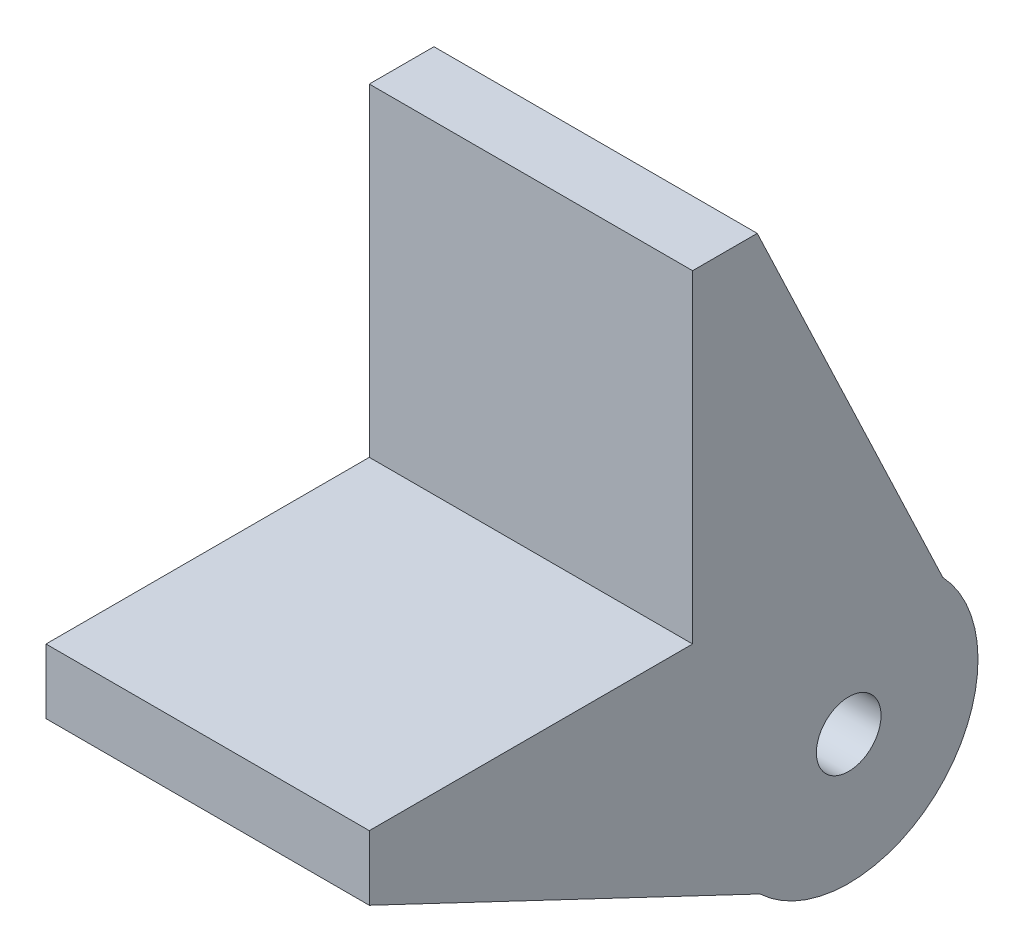
ISO-10303-21;
HEADER;
FILE_DESCRIPTION(('STEP AP214'),'2;1');
FILE_NAME('part.step','',(''),(''),'','','');
FILE_SCHEMA(('AUTOMOTIVE_DESIGN { 1 0 10303 214 1 1 1 1 }'));
ENDSEC;
DATA;
#1=APPLICATION_CONTEXT('core data for automotive mechanical design processes');
#2=APPLICATION_PROTOCOL_DEFINITION('international standard','automotive_design',2000,#1);
#3=PRODUCT_CONTEXT('',#1,'mechanical');
#4=PRODUCT('Part','Part','',(#3));
#5=PRODUCT_RELATED_PRODUCT_CATEGORY('part','',(#4));
#6=PRODUCT_DEFINITION_FORMATION('','',#4);
#7=PRODUCT_DEFINITION_CONTEXT('part definition',#1,'design');
#8=PRODUCT_DEFINITION('design','',#6,#7);
#9=PRODUCT_DEFINITION_SHAPE('','',#8);
#10=(LENGTH_UNIT() NAMED_UNIT(*) SI_UNIT(.MILLI.,.METRE.));
#11=(NAMED_UNIT(*) PLANE_ANGLE_UNIT() SI_UNIT($,.RADIAN.));
#12=(NAMED_UNIT(*) SI_UNIT($,.STERADIAN.) SOLID_ANGLE_UNIT());
#13=UNCERTAINTY_MEASURE_WITH_UNIT(LENGTH_MEASURE(1.E-05),#10,'distance_accuracy_value','');
#14=(GEOMETRIC_REPRESENTATION_CONTEXT(3) GLOBAL_UNCERTAINTY_ASSIGNED_CONTEXT((#13)) GLOBAL_UNIT_ASSIGNED_CONTEXT((#10,
#11,#12)) REPRESENTATION_CONTEXT('',''));
#15=CARTESIAN_POINT('',(0.,0.,0.));
#16=DIRECTION('',(0.,0.,1.));
#17=DIRECTION('',(1.,0.,0.));
#18=AXIS2_PLACEMENT_3D('',#15,#16,#17);
#19=CARTESIAN_POINT('',(0.,0.,0.));
#20=DIRECTION('',(0.,0.,-1.));
#21=DIRECTION('',(-1.,0.,0.));
#22=AXIS2_PLACEMENT_3D('',#19,#20,#21);
#23=PLANE('',#22);
#24=DIRECTION('',(1.,0.,0.));
#25=VECTOR('',#24,1.);
#26=CARTESIAN_POINT('',(10.,-2.,0.));
#27=LINE('',#26,#25);
#28=CARTESIAN_POINT('',(2.,-2.,0.));
#29=VERTEX_POINT('',#28);
#30=CARTESIAN_POINT('',(8.,-2.,0.));
#31=VERTEX_POINT('',#30);
#32=EDGE_CURVE('E227',#29,#31,#27,.T.);
#33=ORIENTED_EDGE('',*,*,#32,.F.);
#34=DIRECTION('',(0.,-1.,0.));
#35=VECTOR('',#34,1.);
#36=CARTESIAN_POINT('',(2.,0.,0.));
#37=LINE('',#36,#35);
#38=CARTESIAN_POINT('',(2.,10.,0.));
#39=VERTEX_POINT('',#38);
#40=EDGE_CURVE('E65',#39,#29,#37,.T.);
#41=ORIENTED_EDGE('',*,*,#40,.F.);
#42=DIRECTION('',(-1.,0.,0.));
#43=VECTOR('',#42,1.);
#44=CARTESIAN_POINT('',(0.,10.,0.));
#45=LINE('',#44,#43);
#46=CARTESIAN_POINT('',(8.,10.,0.));
#47=VERTEX_POINT('',#46);
#48=EDGE_CURVE('E248',#47,#39,#45,.T.);
#49=ORIENTED_EDGE('',*,*,#48,.F.);
#50=DIRECTION('',(0.,1.,0.));
#51=VECTOR('',#50,1.);
#52=CARTESIAN_POINT('',(8.,0.,0.));
#53=LINE('',#52,#51);
#54=EDGE_CURVE('E189',#31,#47,#53,.T.);
#55=ORIENTED_EDGE('',*,*,#54,.F.);
#56=EDGE_LOOP('',(#33,#41,#49,#55));
#57=FACE_BOUND('',#56,.T.);
#58=ADVANCED_FACE('F41',(#57),#23,.T.);
#59=CARTESIAN_POINT('',(0.,-2.,0.));
#60=DIRECTION('',(0.,-1.,0.));
#61=DIRECTION('',(0.,0.,-1.));
#62=AXIS2_PLACEMENT_3D('',#59,#60,#61);
#63=PLANE('',#62);
#64=DIRECTION('',(-1.,0.,0.));
#65=VECTOR('',#64,1.);
#66=CARTESIAN_POINT('',(10.,-2.,12.));
#67=LINE('',#66,#65);
#68=CARTESIAN_POINT('',(8.,-2.,12.));
#69=VERTEX_POINT('',#68);
#70=CARTESIAN_POINT('',(2.,-2.,12.));
#71=VERTEX_POINT('',#70);
#72=EDGE_CURVE('E228',#69,#71,#67,.T.);
#73=ORIENTED_EDGE('',*,*,#72,.T.);
#74=DIRECTION('',(0.,0.,1.));
#75=VECTOR('',#74,1.);
#76=CARTESIAN_POINT('',(2.,-2.,0.));
#77=LINE('',#76,#75);
#78=EDGE_CURVE('E58',#29,#71,#77,.T.);
#79=ORIENTED_EDGE('',*,*,#78,.F.);
#80=ORIENTED_EDGE('',*,*,#32,.T.);
#81=DIRECTION('',(0.,0.,-1.));
#82=VECTOR('',#81,1.);
#83=CARTESIAN_POINT('',(8.,-2.,0.));
#84=LINE('',#83,#82);
#85=EDGE_CURVE('E194',#69,#31,#84,.T.);
#86=ORIENTED_EDGE('',*,*,#85,.F.);
#87=EDGE_LOOP('',(#73,#79,#80,#86));
#88=FACE_BOUND('',#87,.T.);
#89=ADVANCED_FACE('F280',(#88),#63,.T.);
#90=CARTESIAN_POINT('',(0.,0.,2.));
#91=DIRECTION('',(1.,0.,0.));
#92=DIRECTION('',(0.,0.,-1.));
#93=AXIS2_PLACEMENT_3D('',#90,#91,#92);
#94=PLANE('',#93);
#95=CARTESIAN_POINT('',(0.,-4.82842712474619,-2.82842712474619));
#96=DIRECTION('',(1.,0.,0.));
#97=DIRECTION('',(0.,0.,-1.));
#98=AXIS2_PLACEMENT_3D('',#95,#96,#97);
#99=CIRCLE('',#98,1.);
#100=CARTESIAN_POINT('',(0.,-4.82842712474619,-3.82842712474619));
#101=VERTEX_POINT('',#100);
#102=EDGE_CURVE('E326',#101,#101,#99,.T.);
#103=ORIENTED_EDGE('',*,*,#102,.T.);
#104=EDGE_LOOP('',(#103));
#105=FACE_BOUND('',#104,.T.);
#106=DIRECTION('',(0.,0.,-1.));
#107=VECTOR('',#106,1.);
#108=CARTESIAN_POINT('',(0.,10.,2.));
#109=LINE('',#108,#107);
#110=CARTESIAN_POINT('',(0.,10.,2.));
#111=VERTEX_POINT('',#110);
#112=CARTESIAN_POINT('',(0.,10.,0.));
#113=VERTEX_POINT('',#112);
#114=EDGE_CURVE('E51',#111,#113,#109,.T.);
#115=ORIENTED_EDGE('',*,*,#114,.T.);
#116=DIRECTION('',(0.,-0.903322146461795,-0.428962818565496));
#117=VECTOR('',#116,1.);
#118=CARTESIAN_POINT('',(0.,1.84009099711655,-3.87491614018886));
#119=LINE('',#118,#117);
#120=CARTESIAN_POINT('',(0.,-2.08384710721974,-5.73828631848641));
#121=VERTEX_POINT('',#120);
#122=EDGE_CURVE('E168',#113,#121,#119,.T.);
#123=ORIENTED_EDGE('',*,*,#122,.T.);
#124=CARTESIAN_POINT('',(0.,-4.82842712474619,-2.82842712474619));
#125=DIRECTION('',(-1.,0.,0.));
#126=DIRECTION('',(0.,0.,1.));
#127=AXIS2_PLACEMENT_3D('',#124,#125,#126);
#128=CIRCLE('',#127,4.);
#129=CARTESIAN_POINT('',(0.,-7.73828631848641,-0.0838471072197348));
#130=VERTEX_POINT('',#129);
#131=EDGE_CURVE('E137',#121,#130,#128,.T.);
#132=ORIENTED_EDGE('',*,*,#131,.T.);
#133=DIRECTION('',(0.,0.428962818565497,0.903322146461795));
#134=VECTOR('',#133,1.);
#135=CARTESIAN_POINT('',(0.,-6.28188116880332,2.98309242457763));
#136=LINE('',#135,#134);
#137=CARTESIAN_POINT('',(0.,-2.,12.));
#138=VERTEX_POINT('',#137);
#139=EDGE_CURVE('E160',#130,#138,#136,.T.);
#140=ORIENTED_EDGE('',*,*,#139,.T.);
#141=DIRECTION('',(0.,1.,0.));
#142=VECTOR('',#141,1.);
#143=CARTESIAN_POINT('',(0.,-2.,12.));
#144=LINE('',#143,#142);
#145=CARTESIAN_POINT('',(0.,0.,12.));
#146=VERTEX_POINT('',#145);
#147=EDGE_CURVE('E231',#138,#146,#144,.T.);
#148=ORIENTED_EDGE('',*,*,#147,.T.);
#149=DIRECTION('',(0.,0.,-1.));
#150=VECTOR('',#149,1.);
#151=CARTESIAN_POINT('',(0.,0.,0.));
#152=LINE('',#151,#150);
#153=CARTESIAN_POINT('',(0.,0.,2.));
#154=VERTEX_POINT('',#153);
#155=EDGE_CURVE('E237',#146,#154,#152,.T.);
#156=ORIENTED_EDGE('',*,*,#155,.T.);
#157=DIRECTION('',(0.,-1.,0.));
#158=VECTOR('',#157,1.);
#159=CARTESIAN_POINT('',(0.,0.,2.));
#160=LINE('',#159,#158);
#161=EDGE_CURVE('E249',#111,#154,#160,.T.);
#162=ORIENTED_EDGE('',*,*,#161,.F.);
#163=EDGE_LOOP('',(#115,#123,#132,#140,#148,#156,#162));
#164=FACE_BOUND('',#163,.T.);
#165=ADVANCED_FACE('F43',(#105,#164),#94,.F.);
#166=CARTESIAN_POINT('',(10.,0.,2.));
#167=DIRECTION('',(-1.,0.,0.));
#168=DIRECTION('',(0.,0.,1.));
#169=AXIS2_PLACEMENT_3D('',#166,#167,#168);
#170=PLANE('',#169);
#171=CARTESIAN_POINT('',(10.,-4.82842712474619,-2.82842712474619));
#172=DIRECTION('',(1.,0.,0.));
#173=DIRECTION('',(0.,0.,-1.));
#174=AXIS2_PLACEMENT_3D('',#171,#172,#173);
#175=CIRCLE('',#174,1.);
#176=CARTESIAN_POINT('',(10.,-4.82842712474619,-3.82842712474619));
#177=VERTEX_POINT('',#176);
#178=EDGE_CURVE('E323',#177,#177,#175,.T.);
#179=ORIENTED_EDGE('',*,*,#178,.F.);
#180=EDGE_LOOP('',(#179));
#181=FACE_BOUND('',#180,.T.);
#182=DIRECTION('',(0.,-0.903322146461795,-0.428962818565497));
#183=VECTOR('',#182,1.);
#184=CARTESIAN_POINT('',(10.,1.84009099711655,-3.87491614018886));
#185=LINE('',#184,#183);
#186=CARTESIAN_POINT('',(10.,10.,0.));
#187=VERTEX_POINT('',#186);
#188=CARTESIAN_POINT('',(10.,-2.08384710721974,-5.73828631848641));
#189=VERTEX_POINT('',#188);
#190=EDGE_CURVE('E181',#187,#189,#185,.T.);
#191=ORIENTED_EDGE('',*,*,#190,.F.);
#192=DIRECTION('',(0.,0.,-1.));
#193=VECTOR('',#192,1.);
#194=CARTESIAN_POINT('',(10.,10.,2.));
#195=LINE('',#194,#193);
#196=CARTESIAN_POINT('',(10.,10.,2.));
#197=VERTEX_POINT('',#196);
#198=EDGE_CURVE('E11',#197,#187,#195,.T.);
#199=ORIENTED_EDGE('',*,*,#198,.F.);
#200=DIRECTION('',(0.,1.,0.));
#201=VECTOR('',#200,1.);
#202=CARTESIAN_POINT('',(10.,0.,2.));
#203=LINE('',#202,#201);
#204=CARTESIAN_POINT('',(10.,0.,2.));
#205=VERTEX_POINT('',#204);
#206=EDGE_CURVE('E258',#205,#197,#203,.T.);
#207=ORIENTED_EDGE('',*,*,#206,.F.);
#208=DIRECTION('',(0.,0.,1.));
#209=VECTOR('',#208,1.);
#210=CARTESIAN_POINT('',(10.,0.,0.));
#211=LINE('',#210,#209);
#212=CARTESIAN_POINT('',(10.,0.,12.));
#213=VERTEX_POINT('',#212);
#214=EDGE_CURVE('E220',#205,#213,#211,.T.);
#215=ORIENTED_EDGE('',*,*,#214,.T.);
#216=DIRECTION('',(0.,1.,0.));
#217=VECTOR('',#216,1.);
#218=CARTESIAN_POINT('',(10.,-2.,12.));
#219=LINE('',#218,#217);
#220=CARTESIAN_POINT('',(10.,-2.,12.));
#221=VERTEX_POINT('',#220);
#222=EDGE_CURVE('E244',#221,#213,#219,.T.);
#223=ORIENTED_EDGE('',*,*,#222,.F.);
#224=DIRECTION('',(0.,-0.428962818565496,-0.903322146461795));
#225=VECTOR('',#224,1.);
#226=CARTESIAN_POINT('',(10.,-6.28188116880332,2.98309242457763));
#227=LINE('',#226,#225);
#228=CARTESIAN_POINT('',(10.,-7.73828631848641,-0.0838471072197366));
#229=VERTEX_POINT('',#228);
#230=EDGE_CURVE('E210',#221,#229,#227,.T.);
#231=ORIENTED_EDGE('',*,*,#230,.T.);
#232=CARTESIAN_POINT('',(10.,-4.82842712474619,-2.82842712474619));
#233=DIRECTION('',(1.,0.,0.));
#234=DIRECTION('',(0.,0.,-1.));
#235=AXIS2_PLACEMENT_3D('',#232,#233,#234);
#236=CIRCLE('',#235,4.);
#237=EDGE_CURVE('E190',#229,#189,#236,.T.);
#238=ORIENTED_EDGE('',*,*,#237,.T.);
#239=EDGE_LOOP('',(#191,#199,#207,#215,#223,#231,#238));
#240=FACE_BOUND('',#239,.T.);
#241=ADVANCED_FACE('F296',(#181,#240),#170,.F.);
#242=CARTESIAN_POINT('',(0.,10.,2.));
#243=DIRECTION('',(0.,-1.,0.));
#244=DIRECTION('',(0.,0.,-1.));
#245=AXIS2_PLACEMENT_3D('',#242,#243,#244);
#246=PLANE('',#245);
#247=EDGE_CURVE('E254',#187,#47,#45,.T.);
#248=ORIENTED_EDGE('',*,*,#247,.T.);
#249=ORIENTED_EDGE('',*,*,#48,.T.);
#250=DIRECTION('',(-1.,0.,0.));
#251=VECTOR('',#250,1.);
#252=CARTESIAN_POINT('',(2.,10.,0.));
#253=LINE('',#252,#251);
#254=EDGE_CURVE('E144',#39,#113,#253,.T.);
#255=ORIENTED_EDGE('',*,*,#254,.T.);
#256=ORIENTED_EDGE('',*,*,#114,.F.);
#257=DIRECTION('',(-1.,0.,0.));
#258=VECTOR('',#257,1.);
#259=CARTESIAN_POINT('',(0.,10.,2.));
#260=LINE('',#259,#258);
#261=EDGE_CURVE('E261',#197,#111,#260,.T.);
#262=ORIENTED_EDGE('',*,*,#261,.F.);
#263=ORIENTED_EDGE('',*,*,#198,.T.);
#264=EDGE_LOOP('',(#248,#249,#255,#256,#262,#263));
#265=FACE_BOUND('',#264,.T.);
#266=ADVANCED_FACE('F274',(#265),#246,.F.);
#267=CARTESIAN_POINT('',(0.,0.,2.));
#268=DIRECTION('',(0.,0.,-1.));
#269=DIRECTION('',(-1.,0.,0.));
#270=AXIS2_PLACEMENT_3D('',#267,#268,#269);
#271=PLANE('',#270);
#272=ORIENTED_EDGE('',*,*,#161,.T.);
#273=DIRECTION('',(1.,0.,0.));
#274=VECTOR('',#273,1.);
#275=CARTESIAN_POINT('',(0.,0.,2.));
#276=LINE('',#275,#274);
#277=EDGE_CURVE('E253',#154,#205,#276,.T.);
#278=ORIENTED_EDGE('',*,*,#277,.T.);
#279=ORIENTED_EDGE('',*,*,#206,.T.);
#280=ORIENTED_EDGE('',*,*,#261,.T.);
#281=EDGE_LOOP('',(#272,#278,#279,#280));
#282=FACE_BOUND('',#281,.T.);
#283=ADVANCED_FACE('F292',(#282),#271,.F.);
#284=CARTESIAN_POINT('',(10.,-2.,12.));
#285=DIRECTION('',(0.,0.,-1.));
#286=DIRECTION('',(-1.,0.,0.));
#287=AXIS2_PLACEMENT_3D('',#284,#285,#286);
#288=PLANE('',#287);
#289=DIRECTION('',(-1.,0.,0.));
#290=VECTOR('',#289,1.);
#291=CARTESIAN_POINT('',(10.,0.,12.));
#292=LINE('',#291,#290);
#293=EDGE_CURVE('E234',#213,#146,#292,.T.);
#294=ORIENTED_EDGE('',*,*,#293,.T.);
#295=ORIENTED_EDGE('',*,*,#147,.F.);
#296=DIRECTION('',(-1.,0.,0.));
#297=VECTOR('',#296,1.);
#298=CARTESIAN_POINT('',(2.,-2.,12.));
#299=LINE('',#298,#297);
#300=EDGE_CURVE('E177',#71,#138,#299,.T.);
#301=ORIENTED_EDGE('',*,*,#300,.F.);
#302=ORIENTED_EDGE('',*,*,#72,.F.);
#303=EDGE_CURVE('E223',#221,#69,#67,.T.);
#304=ORIENTED_EDGE('',*,*,#303,.F.);
#305=ORIENTED_EDGE('',*,*,#222,.T.);
#306=EDGE_LOOP('',(#294,#295,#301,#302,#304,#305));
#307=FACE_BOUND('',#306,.T.);
#308=ADVANCED_FACE('F371',(#307),#288,.F.);
#309=CARTESIAN_POINT('',(0.,0.,0.));
#310=DIRECTION('',(0.,-1.,0.));
#311=DIRECTION('',(0.,0.,-1.));
#312=AXIS2_PLACEMENT_3D('',#309,#310,#311);
#313=PLANE('',#312);
#314=ORIENTED_EDGE('',*,*,#277,.F.);
#315=ORIENTED_EDGE('',*,*,#155,.F.);
#316=ORIENTED_EDGE('',*,*,#293,.F.);
#317=ORIENTED_EDGE('',*,*,#214,.F.);
#318=EDGE_LOOP('',(#314,#315,#316,#317));
#319=FACE_BOUND('',#318,.T.);
#320=ADVANCED_FACE('F289',(#319),#313,.F.);
#321=CARTESIAN_POINT('',(8.,1.84009099711655,-3.87491614018886));
#322=DIRECTION('',(0.,-0.428962818565497,0.903322146461795));
#323=DIRECTION('',(0.,-0.903322146461795,-0.428962818565497));
#324=AXIS2_PLACEMENT_3D('',#321,#322,#323);
#325=PLANE('',#324);
#326=ORIENTED_EDGE('',*,*,#190,.T.);
#327=DIRECTION('',(1.,0.,0.));
#328=VECTOR('',#327,1.);
#329=CARTESIAN_POINT('',(8.,-2.08384710721974,-5.73828631848641));
#330=LINE('',#329,#328);
#331=CARTESIAN_POINT('',(8.,-2.08384710721974,-5.73828631848641));
#332=VERTEX_POINT('',#331);
#333=EDGE_CURVE('E217',#332,#189,#330,.T.);
#334=ORIENTED_EDGE('',*,*,#333,.F.);
#335=DIRECTION('',(0.,-0.903322146461795,-0.428962818565497));
#336=VECTOR('',#335,1.);
#337=CARTESIAN_POINT('',(8.,1.84009099711655,-3.87491614018886));
#338=LINE('',#337,#336);
#339=EDGE_CURVE('E186',#47,#332,#338,.T.);
#340=ORIENTED_EDGE('',*,*,#339,.F.);
#341=ORIENTED_EDGE('',*,*,#247,.F.);
#342=EDGE_LOOP('',(#326,#334,#340,#341));
#343=FACE_BOUND('',#342,.T.);
#344=ADVANCED_FACE('F299',(#343),#325,.F.);
#345=CARTESIAN_POINT('',(8.,-4.82842712474619,-2.82842712474619));
#346=DIRECTION('',(1.,0.,0.));
#347=DIRECTION('',(0.,0.,-1.));
#348=AXIS2_PLACEMENT_3D('',#345,#346,#347);
#349=CYLINDRICAL_SURFACE('',#348,4.);
#350=ORIENTED_EDGE('',*,*,#237,.F.);
#351=DIRECTION('',(1.,0.,0.));
#352=VECTOR('',#351,1.);
#353=CARTESIAN_POINT('',(8.,-7.73828631848641,-0.0838471072197366));
#354=LINE('',#353,#352);
#355=CARTESIAN_POINT('',(8.,-7.73828631848641,-0.0838471072197366));
#356=VERTEX_POINT('',#355);
#357=EDGE_CURVE('E206',#356,#229,#354,.T.);
#358=ORIENTED_EDGE('',*,*,#357,.F.);
#359=CARTESIAN_POINT('',(8.,-4.82842712474619,-2.82842712474619));
#360=DIRECTION('',(1.,0.,0.));
#361=DIRECTION('',(0.,0.,-1.));
#362=AXIS2_PLACEMENT_3D('',#359,#360,#361);
#363=CIRCLE('',#362,4.);
#364=EDGE_CURVE('E202',#356,#332,#363,.T.);
#365=ORIENTED_EDGE('',*,*,#364,.T.);
#366=ORIENTED_EDGE('',*,*,#333,.T.);
#367=EDGE_LOOP('',(#350,#358,#365,#366));
#368=FACE_BOUND('',#367,.T.);
#369=ADVANCED_FACE('F361',(#368),#349,.T.);
#370=CARTESIAN_POINT('',(8.,-6.28188116880332,2.98309242457763));
#371=DIRECTION('',(0.,-0.903322146461795,0.428962818565496));
#372=DIRECTION('',(0.,-0.428962818565496,-0.903322146461795));
#373=AXIS2_PLACEMENT_3D('',#370,#371,#372);
#374=PLANE('',#373);
#375=ORIENTED_EDGE('',*,*,#230,.F.);
#376=ORIENTED_EDGE('',*,*,#303,.T.);
#377=DIRECTION('',(0.,-0.428962818565496,-0.903322146461795));
#378=VECTOR('',#377,1.);
#379=CARTESIAN_POINT('',(8.,-6.28188116880332,2.98309242457763));
#380=LINE('',#379,#378);
#381=EDGE_CURVE('E198',#69,#356,#380,.T.);
#382=ORIENTED_EDGE('',*,*,#381,.T.);
#383=ORIENTED_EDGE('',*,*,#357,.T.);
#384=EDGE_LOOP('',(#375,#376,#382,#383));
#385=FACE_BOUND('',#384,.T.);
#386=ADVANCED_FACE('F360',(#385),#374,.T.);
#387=CARTESIAN_POINT('',(8.,0.,0.));
#388=DIRECTION('',(1.,0.,0.));
#389=DIRECTION('',(0.,0.,-1.));
#390=AXIS2_PLACEMENT_3D('',#387,#388,#389);
#391=PLANE('',#390);
#392=CARTESIAN_POINT('',(8.,-4.82842712474619,-2.82842712474619));
#393=DIRECTION('',(1.,0.,0.));
#394=DIRECTION('',(0.,0.,-1.));
#395=AXIS2_PLACEMENT_3D('',#392,#393,#394);
#396=CIRCLE('',#395,1.);
#397=CARTESIAN_POINT('',(8.,-4.82842712474619,-3.82842712474619));
#398=VERTEX_POINT('',#397);
#399=EDGE_CURVE('E171',#398,#398,#396,.T.);
#400=ORIENTED_EDGE('',*,*,#399,.T.);
#401=EDGE_LOOP('',(#400));
#402=FACE_BOUND('',#401,.T.);
#403=ORIENTED_EDGE('',*,*,#339,.T.);
#404=ORIENTED_EDGE('',*,*,#364,.F.);
#405=ORIENTED_EDGE('',*,*,#381,.F.);
#406=ORIENTED_EDGE('',*,*,#85,.T.);
#407=ORIENTED_EDGE('',*,*,#54,.T.);
#408=EDGE_LOOP('',(#403,#404,#405,#406,#407));
#409=FACE_BOUND('',#408,.T.);
#410=ADVANCED_FACE('F303',(#402,#409),#391,.F.);
#411=CARTESIAN_POINT('',(2.,-6.28188116880332,2.98309242457763));
#412=DIRECTION('',(0.,-0.903322146461795,0.428962818565497));
#413=DIRECTION('',(0.,-0.428962818565497,-0.903322146461795));
#414=AXIS2_PLACEMENT_3D('',#411,#412,#413);
#415=PLANE('',#414);
#416=ORIENTED_EDGE('',*,*,#139,.F.);
#417=DIRECTION('',(-1.,0.,0.));
#418=VECTOR('',#417,1.);
#419=CARTESIAN_POINT('',(2.,-7.73828631848641,-0.0838471072197348));
#420=LINE('',#419,#418);
#421=CARTESIAN_POINT('',(2.,-7.73828631848641,-0.0838471072197348));
#422=VERTEX_POINT('',#421);
#423=EDGE_CURVE('E143',#422,#130,#420,.T.);
#424=ORIENTED_EDGE('',*,*,#423,.F.);
#425=DIRECTION('',(0.,0.428962818565497,0.903322146461795));
#426=VECTOR('',#425,1.);
#427=CARTESIAN_POINT('',(2.,-6.28188116880332,2.98309242457763));
#428=LINE('',#427,#426);
#429=EDGE_CURVE('E152',#422,#71,#428,.T.);
#430=ORIENTED_EDGE('',*,*,#429,.T.);
#431=ORIENTED_EDGE('',*,*,#300,.T.);
#432=EDGE_LOOP('',(#416,#424,#430,#431));
#433=FACE_BOUND('',#432,.T.);
#434=ADVANCED_FACE('F285',(#433),#415,.T.);
#435=CARTESIAN_POINT('',(2.,-4.82842712474619,-2.82842712474619));
#436=DIRECTION('',(-1.,0.,0.));
#437=DIRECTION('',(0.,0.,1.));
#438=AXIS2_PLACEMENT_3D('',#435,#436,#437);
#439=CYLINDRICAL_SURFACE('',#438,4.);
#440=ORIENTED_EDGE('',*,*,#131,.F.);
#441=DIRECTION('',(-1.,0.,0.));
#442=VECTOR('',#441,1.);
#443=CARTESIAN_POINT('',(2.,-2.08384710721974,-5.73828631848641));
#444=LINE('',#443,#442);
#445=CARTESIAN_POINT('',(2.,-2.08384710721974,-5.73828631848641));
#446=VERTEX_POINT('',#445);
#447=EDGE_CURVE('E132',#446,#121,#444,.T.);
#448=ORIENTED_EDGE('',*,*,#447,.F.);
#449=CARTESIAN_POINT('',(2.,-4.82842712474619,-2.82842712474619));
#450=DIRECTION('',(-1.,0.,0.));
#451=DIRECTION('',(0.,0.,1.));
#452=AXIS2_PLACEMENT_3D('',#449,#450,#451);
#453=CIRCLE('',#452,4.);
#454=EDGE_CURVE('E135',#446,#422,#453,.T.);
#455=ORIENTED_EDGE('',*,*,#454,.T.);
#456=ORIENTED_EDGE('',*,*,#423,.T.);
#457=EDGE_LOOP('',(#440,#448,#455,#456));
#458=FACE_BOUND('',#457,.T.);
#459=ADVANCED_FACE('F134',(#458),#439,.T.);
#460=CARTESIAN_POINT('',(2.,1.84009099711655,-3.87491614018886));
#461=DIRECTION('',(0.,0.428962818565496,-0.903322146461795));
#462=DIRECTION('',(0.,0.903322146461795,0.428962818565496));
#463=AXIS2_PLACEMENT_3D('',#460,#461,#462);
#464=PLANE('',#463);
#465=ORIENTED_EDGE('',*,*,#122,.F.);
#466=ORIENTED_EDGE('',*,*,#254,.F.);
#467=DIRECTION('',(0.,-0.903322146461795,-0.428962818565496));
#468=VECTOR('',#467,1.);
#469=CARTESIAN_POINT('',(2.,1.84009099711655,-3.87491614018886));
#470=LINE('',#469,#468);
#471=EDGE_CURVE('E150',#39,#446,#470,.T.);
#472=ORIENTED_EDGE('',*,*,#471,.T.);
#473=ORIENTED_EDGE('',*,*,#447,.T.);
#474=EDGE_LOOP('',(#465,#466,#472,#473));
#475=FACE_BOUND('',#474,.T.);
#476=ADVANCED_FACE('F156',(#475),#464,.T.);
#477=CARTESIAN_POINT('',(2.,0.,0.));
#478=DIRECTION('',(-1.,0.,0.));
#479=DIRECTION('',(0.,0.,1.));
#480=AXIS2_PLACEMENT_3D('',#477,#478,#479);
#481=PLANE('',#480);
#482=CARTESIAN_POINT('',(2.,-4.82842712474619,-2.82842712474619));
#483=DIRECTION('',(-1.,0.,0.));
#484=DIRECTION('',(0.,0.,1.));
#485=AXIS2_PLACEMENT_3D('',#482,#483,#484);
#486=CIRCLE('',#485,1.);
#487=CARTESIAN_POINT('',(2.,-4.82842712474619,-1.82842712474619));
#488=VERTEX_POINT('',#487);
#489=EDGE_CURVE('E45',#488,#488,#486,.T.);
#490=ORIENTED_EDGE('',*,*,#489,.T.);
#491=EDGE_LOOP('',(#490));
#492=FACE_BOUND('',#491,.T.);
#493=ORIENTED_EDGE('',*,*,#40,.T.);
#494=ORIENTED_EDGE('',*,*,#78,.T.);
#495=ORIENTED_EDGE('',*,*,#429,.F.);
#496=ORIENTED_EDGE('',*,*,#454,.F.);
#497=ORIENTED_EDGE('',*,*,#471,.F.);
#498=EDGE_LOOP('',(#493,#494,#495,#496,#497));
#499=FACE_BOUND('',#498,.T.);
#500=ADVANCED_FACE('F149',(#492,#499),#481,.F.);
#501=CARTESIAN_POINT('',(0.,-4.82842712474619,-2.82842712474619));
#502=DIRECTION('',(1.,0.,0.));
#503=DIRECTION('',(0.,0.,-1.));
#504=AXIS2_PLACEMENT_3D('',#501,#502,#503);
#505=CYLINDRICAL_SURFACE('',#504,1.);
#506=ORIENTED_EDGE('',*,*,#102,.F.);
#507=EDGE_LOOP('',(#506));
#508=FACE_BOUND('',#507,.T.);
#509=ORIENTED_EDGE('',*,*,#489,.F.);
#510=EDGE_LOOP('',(#509));
#511=FACE_BOUND('',#510,.T.);
#512=ADVANCED_FACE('F340',(#508,#511),#505,.F.);
#513=ORIENTED_EDGE('',*,*,#178,.T.);
#514=EDGE_LOOP('',(#513));
#515=FACE_BOUND('',#514,.T.);
#516=ORIENTED_EDGE('',*,*,#399,.F.);
#517=EDGE_LOOP('',(#516));
#518=FACE_BOUND('',#517,.T.);
#519=ADVANCED_FACE('F342',(#515,#518),#505,.F.);
#520=CLOSED_SHELL('',(#58,#89,#165,#241,#266,#283,#308,#320,#344,#369,#386,#410,#434,#459,#476,
#500,#512,#519));
#521=MANIFOLD_SOLID_BREP('B2',#520);
#522=ADVANCED_BREP_SHAPE_REPRESENTATION('',(#18,#521),#14);
#523=SHAPE_DEFINITION_REPRESENTATION(#9,#522);
ENDSEC;
END-ISO-10303-21;
